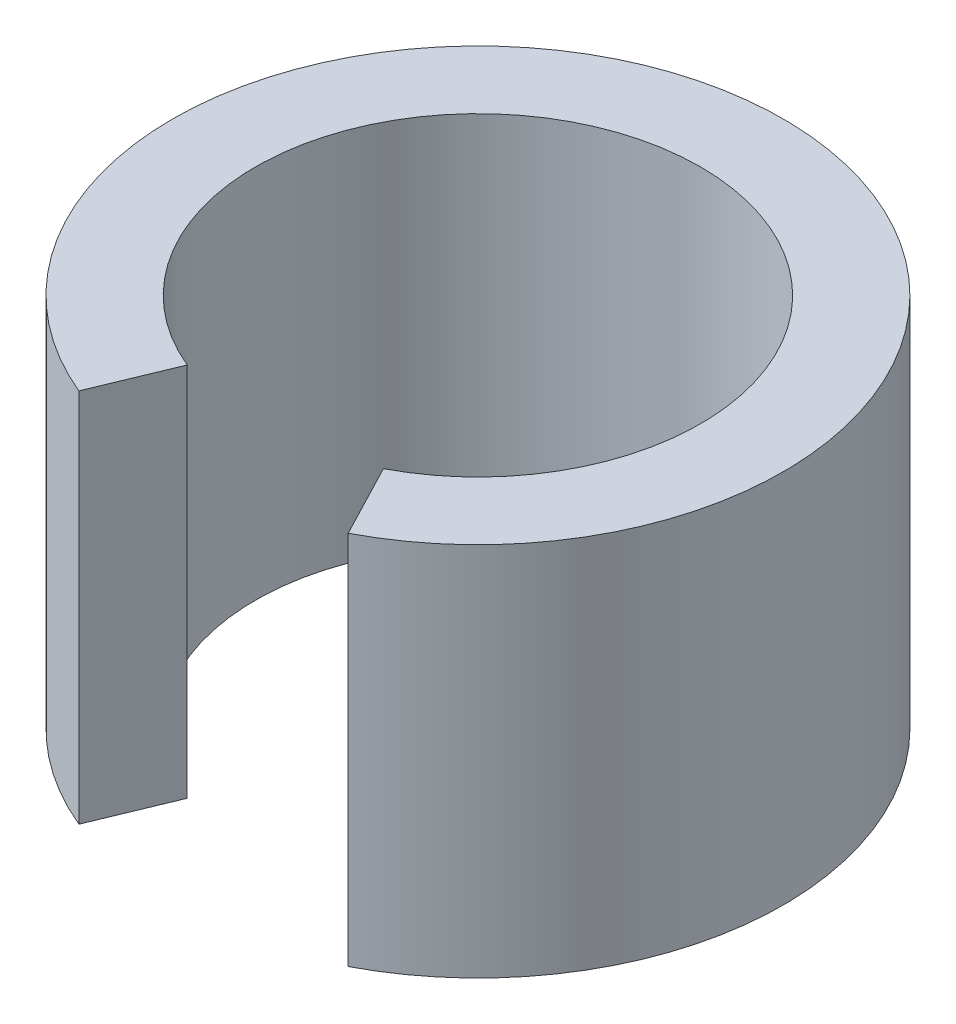
ISO-10303-21;
HEADER;
FILE_DESCRIPTION(('STEP AP214'),'2;1');
FILE_NAME('part.step','',(''),(''),'','','');
FILE_SCHEMA(('AUTOMOTIVE_DESIGN { 1 0 10303 214 1 1 1 1 }'));
ENDSEC;
DATA;
#1=APPLICATION_CONTEXT('core data for automotive mechanical design processes');
#2=APPLICATION_PROTOCOL_DEFINITION('international standard','automotive_design',2000,#1);
#3=PRODUCT_CONTEXT('',#1,'mechanical');
#4=PRODUCT('Part','Part','',(#3));
#5=PRODUCT_RELATED_PRODUCT_CATEGORY('part','',(#4));
#6=PRODUCT_DEFINITION_FORMATION('','',#4);
#7=PRODUCT_DEFINITION_CONTEXT('part definition',#1,'design');
#8=PRODUCT_DEFINITION('design','',#6,#7);
#9=PRODUCT_DEFINITION_SHAPE('','',#8);
#10=(LENGTH_UNIT() NAMED_UNIT(*) SI_UNIT(.MILLI.,.METRE.));
#11=(NAMED_UNIT(*) PLANE_ANGLE_UNIT() SI_UNIT($,.RADIAN.));
#12=(NAMED_UNIT(*) SI_UNIT($,.STERADIAN.) SOLID_ANGLE_UNIT());
#13=UNCERTAINTY_MEASURE_WITH_UNIT(LENGTH_MEASURE(1.E-05),#10,'distance_accuracy_value','');
#14=(GEOMETRIC_REPRESENTATION_CONTEXT(3) GLOBAL_UNCERTAINTY_ASSIGNED_CONTEXT((#13)) GLOBAL_UNIT_ASSIGNED_CONTEXT((#10,
#11,#12)) REPRESENTATION_CONTEXT('',''));
#15=CARTESIAN_POINT('',(0.,0.,0.));
#16=DIRECTION('',(0.,0.,1.));
#17=DIRECTION('',(1.,0.,0.));
#18=AXIS2_PLACEMENT_3D('',#15,#16,#17);
#19=CARTESIAN_POINT('',(0.,4.3,0.));
#20=DIRECTION('',(0.,-1.,0.));
#21=DIRECTION('',(0.,0.,-1.));
#22=AXIS2_PLACEMENT_3D('',#19,#20,#21);
#23=CYLINDRICAL_SURFACE('',#22,2.55);
#24=CARTESIAN_POINT('',(0.,0.,0.));
#25=DIRECTION('',(0.,-1.,0.));
#26=DIRECTION('',(0.,0.,-1.));
#27=AXIS2_PLACEMENT_3D('',#24,#25,#26);
#28=CIRCLE('',#27,2.55);
#29=CARTESIAN_POINT('',(-0.974952316921172,0.,2.35626144129425));
#30=VERTEX_POINT('',#29);
#31=CARTESIAN_POINT('',(1.17831371428686,0.,2.26143246432952));
#32=VERTEX_POINT('',#31);
#33=EDGE_CURVE('E102',#30,#32,#28,.T.);
#34=ORIENTED_EDGE('',*,*,#33,.T.);
#35=DIRECTION('',(0.,-1.,0.));
#36=VECTOR('',#35,1.);
#37=CARTESIAN_POINT('',(1.17831371428686,4.3,2.26143246432952));
#38=LINE('',#37,#36);
#39=CARTESIAN_POINT('',(1.17831371428686,4.3,2.26143246432952));
#40=VERTEX_POINT('',#39);
#41=EDGE_CURVE('E11',#40,#32,#38,.T.);
#42=ORIENTED_EDGE('',*,*,#41,.F.);
#43=CARTESIAN_POINT('',(0.,4.3,0.));
#44=DIRECTION('',(0.,-1.,0.));
#45=DIRECTION('',(0.,0.,-1.));
#46=AXIS2_PLACEMENT_3D('',#43,#44,#45);
#47=CIRCLE('',#46,2.55);
#48=CARTESIAN_POINT('',(-0.974952316921172,4.3,2.35626144129425));
#49=VERTEX_POINT('',#48);
#50=EDGE_CURVE('E90',#49,#40,#47,.T.);
#51=ORIENTED_EDGE('',*,*,#50,.F.);
#52=DIRECTION('',(0.,-1.,0.));
#53=VECTOR('',#52,1.);
#54=CARTESIAN_POINT('',(-0.974952316921172,4.3,2.35626144129425));
#55=LINE('',#54,#53);
#56=EDGE_CURVE('E98',#49,#30,#55,.T.);
#57=ORIENTED_EDGE('',*,*,#56,.T.);
#58=EDGE_LOOP('',(#34,#42,#51,#57));
#59=FACE_BOUND('',#58,.T.);
#60=ADVANCED_FACE('F39',(#59),#23,.F.);
#61=CARTESIAN_POINT('',(1.61729333333491,4.3,3.10392691182484));
#62=DIRECTION('',(0.886836260521382,0.,-0.462083809524258));
#63=DIRECTION('',(-0.462083809524258,0.,-0.886836260521382));
#64=AXIS2_PLACEMENT_3D('',#61,#62,#63);
#65=PLANE('',#64);
#66=DIRECTION('',(0.462083809524258,0.,0.886836260521382));
#67=VECTOR('',#66,1.);
#68=CARTESIAN_POINT('',(1.61729333333491,0.,3.10392691182484));
#69=LINE('',#68,#67);
#70=CARTESIAN_POINT('',(1.61729333333491,0.,3.10392691182484));
#71=VERTEX_POINT('',#70);
#72=EDGE_CURVE('E94',#32,#71,#69,.T.);
#73=ORIENTED_EDGE('',*,*,#72,.T.);
#74=DIRECTION('',(0.,-1.,0.));
#75=VECTOR('',#74,1.);
#76=CARTESIAN_POINT('',(1.61729333333491,4.3,3.10392691182484));
#77=LINE('',#76,#75);
#78=CARTESIAN_POINT('',(1.61729333333491,4.3,3.10392691182484));
#79=VERTEX_POINT('',#78);
#80=EDGE_CURVE('E47',#79,#71,#77,.T.);
#81=ORIENTED_EDGE('',*,*,#80,.F.);
#82=DIRECTION('',(0.462083809524258,0.,0.886836260521382));
#83=VECTOR('',#82,1.);
#84=CARTESIAN_POINT('',(1.61729333333491,4.3,3.10392691182484));
#85=LINE('',#84,#83);
#86=EDGE_CURVE('E85',#40,#79,#85,.T.);
#87=ORIENTED_EDGE('',*,*,#86,.F.);
#88=ORIENTED_EDGE('',*,*,#41,.T.);
#89=EDGE_LOOP('',(#73,#81,#87,#88));
#90=FACE_BOUND('',#89,.T.);
#91=ADVANCED_FACE('F93',(#90),#65,.F.);
#92=CARTESIAN_POINT('',(0.,4.3,0.));
#93=DIRECTION('',(0.,-1.,0.));
#94=DIRECTION('',(0.,0.,-1.));
#95=AXIS2_PLACEMENT_3D('',#92,#93,#94);
#96=CYLINDRICAL_SURFACE('',#95,3.5);
#97=CARTESIAN_POINT('',(0.,0.,0.));
#98=DIRECTION('',(0.,1.,0.));
#99=DIRECTION('',(0.,0.,-1.));
#100=AXIS2_PLACEMENT_3D('',#97,#98,#99);
#101=CIRCLE('',#100,3.5);
#102=CARTESIAN_POINT('',(-1.33816984675455,0.,3.23408433118818));
#103=VERTEX_POINT('',#102);
#104=EDGE_CURVE('E72',#71,#103,#101,.T.);
#105=ORIENTED_EDGE('',*,*,#104,.T.);
#106=DIRECTION('',(0.,-1.,0.));
#107=VECTOR('',#106,1.);
#108=CARTESIAN_POINT('',(-1.33816984675455,4.3,3.23408433118818));
#109=LINE('',#108,#107);
#110=CARTESIAN_POINT('',(-1.33816984675455,4.3,3.23408433118818));
#111=VERTEX_POINT('',#110);
#112=EDGE_CURVE('E95',#111,#103,#109,.T.);
#113=ORIENTED_EDGE('',*,*,#112,.F.);
#114=CARTESIAN_POINT('',(0.,4.3,0.));
#115=DIRECTION('',(0.,1.,0.));
#116=DIRECTION('',(0.,0.,-1.));
#117=AXIS2_PLACEMENT_3D('',#114,#115,#116);
#118=CIRCLE('',#117,3.5);
#119=EDGE_CURVE('E88',#79,#111,#118,.T.);
#120=ORIENTED_EDGE('',*,*,#119,.F.);
#121=ORIENTED_EDGE('',*,*,#80,.T.);
#122=EDGE_LOOP('',(#105,#113,#120,#121));
#123=FACE_BOUND('',#122,.T.);
#124=ADVANCED_FACE('F96',(#123),#96,.T.);
#125=CARTESIAN_POINT('',(-1.33816984675455,4.3,3.23408433118818));
#126=DIRECTION('',(-0.924024094625194,0.,-0.382334241929872));
#127=DIRECTION('',(-0.382334241929872,0.,0.924024094625194));
#128=AXIS2_PLACEMENT_3D('',#125,#126,#127);
#129=PLANE('',#128);
#130=DIRECTION('',(0.382334241929872,0.,-0.924024094625194));
#131=VECTOR('',#130,1.);
#132=CARTESIAN_POINT('',(-1.33816984675455,0.,3.23408433118818));
#133=LINE('',#132,#131);
#134=EDGE_CURVE('E78',#103,#30,#133,.T.);
#135=ORIENTED_EDGE('',*,*,#134,.T.);
#136=ORIENTED_EDGE('',*,*,#56,.F.);
#137=DIRECTION('',(0.382334241929872,0.,-0.924024094625194));
#138=VECTOR('',#137,1.);
#139=CARTESIAN_POINT('',(-1.33816984675455,4.3,3.23408433118818));
#140=LINE('',#139,#138);
#141=EDGE_CURVE('E55',#111,#49,#140,.T.);
#142=ORIENTED_EDGE('',*,*,#141,.F.);
#143=ORIENTED_EDGE('',*,*,#112,.T.);
#144=EDGE_LOOP('',(#135,#136,#142,#143));
#145=FACE_BOUND('',#144,.T.);
#146=ADVANCED_FACE('F109',(#145),#129,.F.);
#147=CARTESIAN_POINT('',(0.,4.3,0.));
#148=DIRECTION('',(0.,-1.,0.));
#149=DIRECTION('',(0.,0.,-1.));
#150=AXIS2_PLACEMENT_3D('',#147,#148,#149);
#151=PLANE('',#150);
#152=ORIENTED_EDGE('',*,*,#50,.T.);
#153=ORIENTED_EDGE('',*,*,#86,.T.);
#154=ORIENTED_EDGE('',*,*,#119,.T.);
#155=ORIENTED_EDGE('',*,*,#141,.T.);
#156=EDGE_LOOP('',(#152,#153,#154,#155));
#157=FACE_BOUND('',#156,.T.);
#158=ADVANCED_FACE('F86',(#157),#151,.F.);
#159=CARTESIAN_POINT('',(0.,0.,0.));
#160=DIRECTION('',(0.,-1.,0.));
#161=DIRECTION('',(0.,0.,-1.));
#162=AXIS2_PLACEMENT_3D('',#159,#160,#161);
#163=PLANE('',#162);
#164=ORIENTED_EDGE('',*,*,#33,.F.);
#165=ORIENTED_EDGE('',*,*,#134,.F.);
#166=ORIENTED_EDGE('',*,*,#104,.F.);
#167=ORIENTED_EDGE('',*,*,#72,.F.);
#168=EDGE_LOOP('',(#164,#165,#166,#167));
#169=FACE_BOUND('',#168,.T.);
#170=ADVANCED_FACE('F112',(#169),#163,.T.);
#171=CLOSED_SHELL('',(#60,#91,#124,#146,#158,#170));
#172=MANIFOLD_SOLID_BREP('B2',#171);
#173=ADVANCED_BREP_SHAPE_REPRESENTATION('',(#18,#172),#14);
#174=SHAPE_DEFINITION_REPRESENTATION(#9,#173);
ENDSEC;
END-ISO-10303-21;
